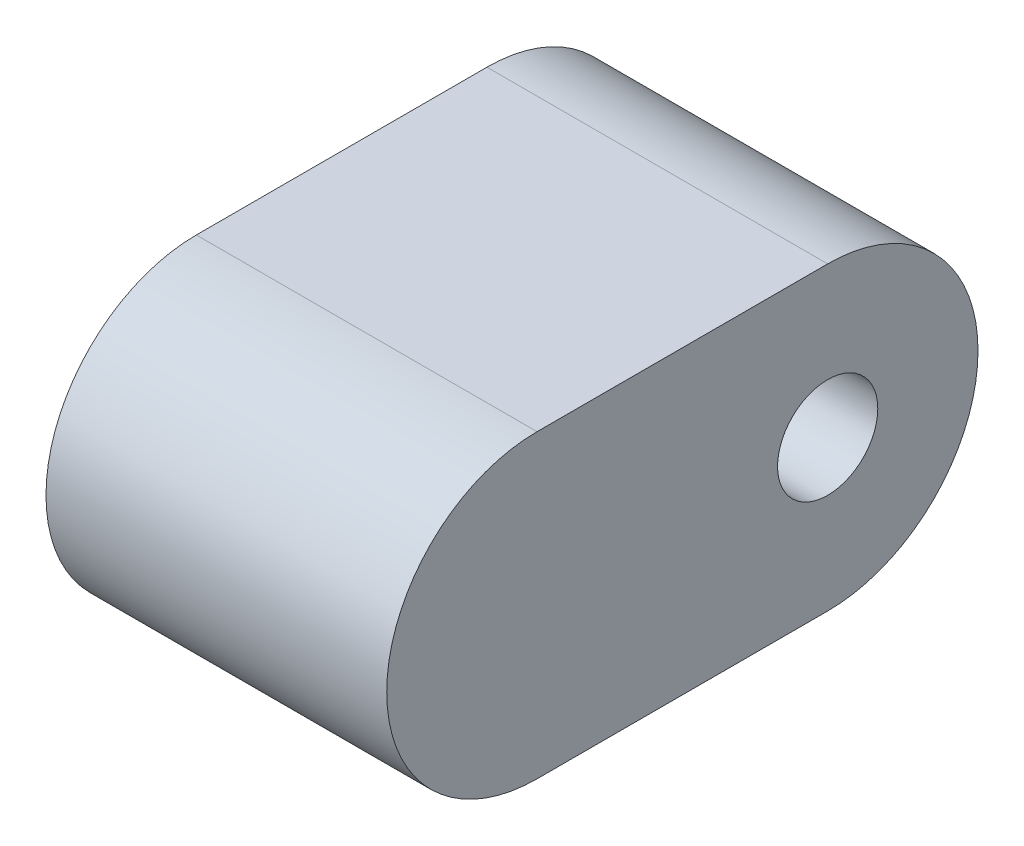
ISO-10303-21;
HEADER;
FILE_DESCRIPTION(('STEP AP214'),'2;1');
FILE_NAME('part.step','',(''),(''),'','','');
FILE_SCHEMA(('AUTOMOTIVE_DESIGN { 1 0 10303 214 1 1 1 1 }'));
ENDSEC;
DATA;
#1=APPLICATION_CONTEXT('core data for automotive mechanical design processes');
#2=APPLICATION_PROTOCOL_DEFINITION('international standard','automotive_design',2000,#1);
#3=PRODUCT_CONTEXT('',#1,'mechanical');
#4=PRODUCT('Part','Part','',(#3));
#5=PRODUCT_RELATED_PRODUCT_CATEGORY('part','',(#4));
#6=PRODUCT_DEFINITION_FORMATION('','',#4);
#7=PRODUCT_DEFINITION_CONTEXT('part definition',#1,'design');
#8=PRODUCT_DEFINITION('design','',#6,#7);
#9=PRODUCT_DEFINITION_SHAPE('','',#8);
#10=(LENGTH_UNIT() NAMED_UNIT(*) SI_UNIT(.MILLI.,.METRE.));
#11=(NAMED_UNIT(*) PLANE_ANGLE_UNIT() SI_UNIT($,.RADIAN.));
#12=(NAMED_UNIT(*) SI_UNIT($,.STERADIAN.) SOLID_ANGLE_UNIT());
#13=UNCERTAINTY_MEASURE_WITH_UNIT(LENGTH_MEASURE(1.E-05),#10,'distance_accuracy_value','');
#14=(GEOMETRIC_REPRESENTATION_CONTEXT(3) GLOBAL_UNCERTAINTY_ASSIGNED_CONTEXT((#13)) GLOBAL_UNIT_ASSIGNED_CONTEXT((#10,
#11,#12)) REPRESENTATION_CONTEXT('',''));
#15=CARTESIAN_POINT('',(0.,0.,0.));
#16=DIRECTION('',(0.,0.,1.));
#17=DIRECTION('',(1.,0.,0.));
#18=AXIS2_PLACEMENT_3D('',#15,#16,#17);
#19=CARTESIAN_POINT('',(8.5,0.,14.5));
#20=DIRECTION('',(1.,0.,0.));
#21=DIRECTION('',(0.,0.,-1.));
#22=AXIS2_PLACEMENT_3D('',#19,#20,#21);
#23=PLANE('',#22);
#24=CARTESIAN_POINT('',(8.5,0.,14.5));
#25=DIRECTION('',(1.,0.,0.));
#26=DIRECTION('',(0.,0.,-1.));
#27=AXIS2_PLACEMENT_3D('',#24,#25,#26);
#28=CIRCLE('',#27,7.5);
#29=CARTESIAN_POINT('',(8.5,7.5,14.5));
#30=VERTEX_POINT('',#29);
#31=CARTESIAN_POINT('',(8.5,-7.5,14.5));
#32=VERTEX_POINT('',#31);
#33=EDGE_CURVE('E85',#30,#32,#28,.T.);
#34=ORIENTED_EDGE('',*,*,#33,.T.);
#35=DIRECTION('',(0.,0.,-1.));
#36=VECTOR('',#35,1.);
#37=CARTESIAN_POINT('',(8.5,-7.5,0.));
#38=LINE('',#37,#36);
#39=CARTESIAN_POINT('',(8.5,-7.5,0.));
#40=VERTEX_POINT('',#39);
#41=EDGE_CURVE('E80',#32,#40,#38,.T.);
#42=ORIENTED_EDGE('',*,*,#41,.T.);
#43=CARTESIAN_POINT('',(8.5,0.,0.));
#44=DIRECTION('',(1.,0.,0.));
#45=DIRECTION('',(0.,0.,-1.));
#46=AXIS2_PLACEMENT_3D('',#43,#44,#45);
#47=CIRCLE('',#46,7.5);
#48=CARTESIAN_POINT('',(8.5,7.5,0.));
#49=VERTEX_POINT('',#48);
#50=EDGE_CURVE('E83',#40,#49,#47,.T.);
#51=ORIENTED_EDGE('',*,*,#50,.T.);
#52=DIRECTION('',(0.,0.,1.));
#53=VECTOR('',#52,1.);
#54=CARTESIAN_POINT('',(8.5,7.5,0.));
#55=LINE('',#54,#53);
#56=EDGE_CURVE('E50',#49,#30,#55,.T.);
#57=ORIENTED_EDGE('',*,*,#56,.T.);
#58=EDGE_LOOP('',(#34,#42,#51,#57));
#59=FACE_BOUND('',#58,.T.);
#60=CARTESIAN_POINT('',(8.5,0.,0.));
#61=DIRECTION('',(1.,0.,0.));
#62=DIRECTION('',(0.,0.,-1.));
#63=AXIS2_PLACEMENT_3D('',#60,#61,#62);
#64=CIRCLE('',#63,2.5);
#65=CARTESIAN_POINT('',(8.5,0.,-2.5));
#66=VERTEX_POINT('',#65);
#67=EDGE_CURVE('E100',#66,#66,#64,.T.);
#68=ORIENTED_EDGE('',*,*,#67,.F.);
#69=EDGE_LOOP('',(#68));
#70=FACE_BOUND('',#69,.T.);
#71=ADVANCED_FACE('F33',(#59,#70),#23,.T.);
#72=CARTESIAN_POINT('',(-8.5,0.,14.5));
#73=DIRECTION('',(1.,0.,0.));
#74=DIRECTION('',(0.,0.,-1.));
#75=AXIS2_PLACEMENT_3D('',#72,#73,#74);
#76=PLANE('',#75);
#77=CARTESIAN_POINT('',(-8.5,0.,14.5));
#78=DIRECTION('',(1.,0.,0.));
#79=DIRECTION('',(0.,0.,-1.));
#80=AXIS2_PLACEMENT_3D('',#77,#78,#79);
#81=CIRCLE('',#80,7.5);
#82=CARTESIAN_POINT('',(-8.5,7.5,14.5));
#83=VERTEX_POINT('',#82);
#84=CARTESIAN_POINT('',(-8.5,-7.5,14.5));
#85=VERTEX_POINT('',#84);
#86=EDGE_CURVE('E97',#83,#85,#81,.T.);
#87=ORIENTED_EDGE('',*,*,#86,.F.);
#88=DIRECTION('',(0.,0.,1.));
#89=VECTOR('',#88,1.);
#90=CARTESIAN_POINT('',(-8.5,7.5,0.));
#91=LINE('',#90,#89);
#92=CARTESIAN_POINT('',(-8.5,7.5,0.));
#93=VERTEX_POINT('',#92);
#94=EDGE_CURVE('E73',#93,#83,#91,.T.);
#95=ORIENTED_EDGE('',*,*,#94,.F.);
#96=CARTESIAN_POINT('',(-8.5,0.,0.));
#97=DIRECTION('',(1.,0.,0.));
#98=DIRECTION('',(0.,0.,-1.));
#99=AXIS2_PLACEMENT_3D('',#96,#97,#98);
#100=CIRCLE('',#99,7.5);
#101=CARTESIAN_POINT('',(-8.5,-7.5,0.));
#102=VERTEX_POINT('',#101);
#103=EDGE_CURVE('E67',#102,#93,#100,.T.);
#104=ORIENTED_EDGE('',*,*,#103,.F.);
#105=DIRECTION('',(0.,0.,-1.));
#106=VECTOR('',#105,1.);
#107=CARTESIAN_POINT('',(-8.5,-7.5,0.));
#108=LINE('',#107,#106);
#109=EDGE_CURVE('E89',#85,#102,#108,.T.);
#110=ORIENTED_EDGE('',*,*,#109,.F.);
#111=EDGE_LOOP('',(#87,#95,#104,#110));
#112=FACE_BOUND('',#111,.T.);
#113=CARTESIAN_POINT('',(-8.5,0.,0.));
#114=DIRECTION('',(1.,0.,0.));
#115=DIRECTION('',(0.,0.,-1.));
#116=AXIS2_PLACEMENT_3D('',#113,#114,#115);
#117=CIRCLE('',#116,2.5);
#118=CARTESIAN_POINT('',(-8.5,0.,-2.5));
#119=VERTEX_POINT('',#118);
#120=EDGE_CURVE('E112',#119,#119,#117,.T.);
#121=ORIENTED_EDGE('',*,*,#120,.T.);
#122=EDGE_LOOP('',(#121));
#123=FACE_BOUND('',#122,.T.);
#124=ADVANCED_FACE('F108',(#112,#123),#76,.F.);
#125=CARTESIAN_POINT('',(8.5,0.,14.5));
#126=DIRECTION('',(-1.,0.,0.));
#127=DIRECTION('',(0.,0.,1.));
#128=AXIS2_PLACEMENT_3D('',#125,#126,#127);
#129=CYLINDRICAL_SURFACE('',#128,7.5);
#130=ORIENTED_EDGE('',*,*,#86,.T.);
#131=DIRECTION('',(-1.,0.,0.));
#132=VECTOR('',#131,1.);
#133=CARTESIAN_POINT('',(8.5,-7.5,14.5));
#134=LINE('',#133,#132);
#135=EDGE_CURVE('E11',#32,#85,#134,.T.);
#136=ORIENTED_EDGE('',*,*,#135,.F.);
#137=ORIENTED_EDGE('',*,*,#33,.F.);
#138=DIRECTION('',(-1.,0.,0.));
#139=VECTOR('',#138,1.);
#140=CARTESIAN_POINT('',(8.5,7.5,14.5));
#141=LINE('',#140,#139);
#142=EDGE_CURVE('E93',#30,#83,#141,.T.);
#143=ORIENTED_EDGE('',*,*,#142,.T.);
#144=EDGE_LOOP('',(#130,#136,#137,#143));
#145=FACE_BOUND('',#144,.T.);
#146=ADVANCED_FACE('F35',(#145),#129,.T.);
#147=CARTESIAN_POINT('',(8.5,-7.5,0.));
#148=DIRECTION('',(0.,1.,0.));
#149=DIRECTION('',(0.,0.,1.));
#150=AXIS2_PLACEMENT_3D('',#147,#148,#149);
#151=PLANE('',#150);
#152=ORIENTED_EDGE('',*,*,#109,.T.);
#153=DIRECTION('',(-1.,0.,0.));
#154=VECTOR('',#153,1.);
#155=CARTESIAN_POINT('',(8.5,-7.5,0.));
#156=LINE('',#155,#154);
#157=EDGE_CURVE('E42',#40,#102,#156,.T.);
#158=ORIENTED_EDGE('',*,*,#157,.F.);
#159=ORIENTED_EDGE('',*,*,#41,.F.);
#160=ORIENTED_EDGE('',*,*,#135,.T.);
#161=EDGE_LOOP('',(#152,#158,#159,#160));
#162=FACE_BOUND('',#161,.T.);
#163=ADVANCED_FACE('F88',(#162),#151,.F.);
#164=CARTESIAN_POINT('',(8.5,0.,0.));
#165=DIRECTION('',(-1.,0.,0.));
#166=DIRECTION('',(0.,0.,1.));
#167=AXIS2_PLACEMENT_3D('',#164,#165,#166);
#168=CYLINDRICAL_SURFACE('',#167,7.5);
#169=ORIENTED_EDGE('',*,*,#103,.T.);
#170=DIRECTION('',(-1.,0.,0.));
#171=VECTOR('',#170,1.);
#172=CARTESIAN_POINT('',(8.5,7.5,0.));
#173=LINE('',#172,#171);
#174=EDGE_CURVE('E90',#49,#93,#173,.T.);
#175=ORIENTED_EDGE('',*,*,#174,.F.);
#176=ORIENTED_EDGE('',*,*,#50,.F.);
#177=ORIENTED_EDGE('',*,*,#157,.T.);
#178=EDGE_LOOP('',(#169,#175,#176,#177));
#179=FACE_BOUND('',#178,.T.);
#180=ADVANCED_FACE('F91',(#179),#168,.T.);
#181=CARTESIAN_POINT('',(8.5,7.5,0.));
#182=DIRECTION('',(0.,-1.,0.));
#183=DIRECTION('',(0.,0.,-1.));
#184=AXIS2_PLACEMENT_3D('',#181,#182,#183);
#185=PLANE('',#184);
#186=ORIENTED_EDGE('',*,*,#94,.T.);
#187=ORIENTED_EDGE('',*,*,#142,.F.);
#188=ORIENTED_EDGE('',*,*,#56,.F.);
#189=ORIENTED_EDGE('',*,*,#174,.T.);
#190=EDGE_LOOP('',(#186,#187,#188,#189));
#191=FACE_BOUND('',#190,.T.);
#192=ADVANCED_FACE('F105',(#191),#185,.F.);
#193=CARTESIAN_POINT('',(8.5,0.,0.));
#194=DIRECTION('',(-1.,0.,0.));
#195=DIRECTION('',(0.,0.,1.));
#196=AXIS2_PLACEMENT_3D('',#193,#194,#195);
#197=CYLINDRICAL_SURFACE('',#196,2.5);
#198=ORIENTED_EDGE('',*,*,#67,.T.);
#199=EDGE_LOOP('',(#198));
#200=FACE_BOUND('',#199,.T.);
#201=ORIENTED_EDGE('',*,*,#120,.F.);
#202=EDGE_LOOP('',(#201));
#203=FACE_BOUND('',#202,.T.);
#204=ADVANCED_FACE('F118',(#200,#203),#197,.F.);
#205=CLOSED_SHELL('',(#71,#124,#146,#163,#180,#192,#204));
#206=MANIFOLD_SOLID_BREP('B2',#205);
#207=ADVANCED_BREP_SHAPE_REPRESENTATION('',(#18,#206),#14);
#208=SHAPE_DEFINITION_REPRESENTATION(#9,#207);
ENDSEC;
END-ISO-10303-21;
